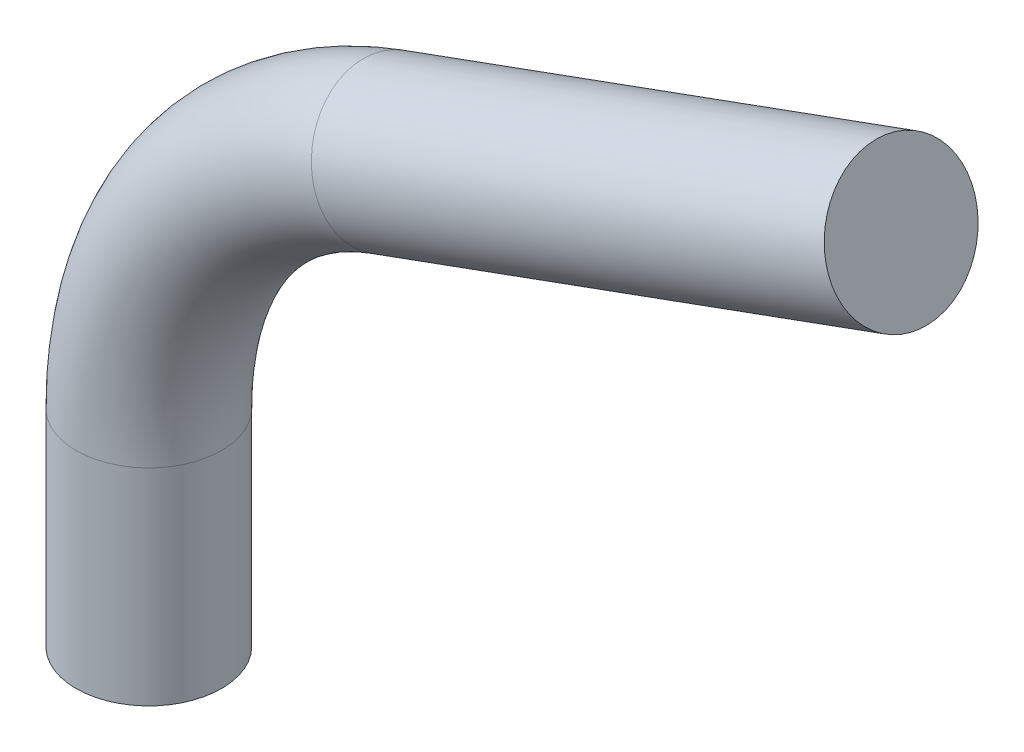
ISO-10303-21;
HEADER;
FILE_DESCRIPTION(('STEP AP214'),'2;1');
FILE_NAME('part.step','',(''),(''),'','','');
FILE_SCHEMA(('AUTOMOTIVE_DESIGN { 1 0 10303 214 1 1 1 1 }'));
ENDSEC;
DATA;
#1=APPLICATION_CONTEXT('core data for automotive mechanical design processes');
#2=APPLICATION_PROTOCOL_DEFINITION('international standard','automotive_design',2000,#1);
#3=PRODUCT_CONTEXT('',#1,'mechanical');
#4=PRODUCT('Part','Part','',(#3));
#5=PRODUCT_RELATED_PRODUCT_CATEGORY('part','',(#4));
#6=PRODUCT_DEFINITION_FORMATION('','',#4);
#7=PRODUCT_DEFINITION_CONTEXT('part definition',#1,'design');
#8=PRODUCT_DEFINITION('design','',#6,#7);
#9=PRODUCT_DEFINITION_SHAPE('','',#8);
#10=(LENGTH_UNIT() NAMED_UNIT(*) SI_UNIT(.MILLI.,.METRE.));
#11=(NAMED_UNIT(*) PLANE_ANGLE_UNIT() SI_UNIT($,.RADIAN.));
#12=(NAMED_UNIT(*) SI_UNIT($,.STERADIAN.) SOLID_ANGLE_UNIT());
#13=UNCERTAINTY_MEASURE_WITH_UNIT(LENGTH_MEASURE(1.E-05),#10,'distance_accuracy_value','');
#14=(GEOMETRIC_REPRESENTATION_CONTEXT(3) GLOBAL_UNCERTAINTY_ASSIGNED_CONTEXT((#13)) GLOBAL_UNIT_ASSIGNED_CONTEXT((#10,
#11,#12)) REPRESENTATION_CONTEXT('',''));
#15=CARTESIAN_POINT('',(0.,0.,0.));
#16=DIRECTION('',(0.,0.,1.));
#17=DIRECTION('',(1.,0.,0.));
#18=AXIS2_PLACEMENT_3D('',#15,#16,#17);
#19=CARTESIAN_POINT('',(0.,0.,0.));
#20=DIRECTION('',(0.,1.,0.));
#21=DIRECTION('',(0.,0.,1.));
#22=AXIS2_PLACEMENT_3D('',#19,#20,#21);
#23=PLANE('',#22);
#24=CARTESIAN_POINT('',(0.,0.,0.));
#25=DIRECTION('',(0.,1.,0.));
#26=DIRECTION('',(0.,0.,1.));
#27=AXIS2_PLACEMENT_3D('',#24,#25,#26);
#28=CIRCLE('',#27,3.);
#29=CARTESIAN_POINT('',(0.,0.,3.));
#30=VERTEX_POINT('',#29);
#31=EDGE_CURVE('E46',#30,#30,#28,.T.);
#32=ORIENTED_EDGE('',*,*,#31,.F.);
#33=EDGE_LOOP('',(#32));
#34=FACE_BOUND('',#33,.T.);
#35=ADVANCED_FACE('F34',(#34),#23,.F.);
#36=CARTESIAN_POINT('',(31.009856485935,30.286664729747,0.));
#37=DIRECTION('',(0.939692620785909,0.342020143325666,0.));
#38=DIRECTION('',(0.,0.,1.));
#39=AXIS2_PLACEMENT_3D('',#36,#37,#38);
#40=PLANE('',#39);
#41=CARTESIAN_POINT('',(31.009856485935,30.286664729747,0.));
#42=DIRECTION('',(0.939692620785909,0.342020143325666,0.));
#43=DIRECTION('',(0.,0.,1.));
#44=AXIS2_PLACEMENT_3D('',#41,#42,#43);
#45=CIRCLE('',#44,3.);
#46=CARTESIAN_POINT('',(31.009856485935,30.286664729747,3.));
#47=VERTEX_POINT('',#46);
#48=EDGE_CURVE('E11',#47,#47,#45,.T.);
#49=ORIENTED_EDGE('',*,*,#48,.T.);
#50=EDGE_LOOP('',(#49));
#51=FACE_BOUND('',#50,.T.);
#52=ADVANCED_FACE('F49',(#51),#40,.T.);
#53=CARTESIAN_POINT('',(0.,0.,0.));
#54=DIRECTION('',(0.,1.,0.));
#55=DIRECTION('',(0.,0.,1.));
#56=AXIS2_PLACEMENT_3D('',#53,#54,#55);
#57=CYLINDRICAL_SURFACE('',#56,3.);
#58=CARTESIAN_POINT('',(0.,8.49688692685432,0.));
#59=DIRECTION('',(0.,1.,0.));
#60=DIRECTION('',(0.,0.,1.));
#61=AXIS2_PLACEMENT_3D('',#58,#59,#60);
#62=CIRCLE('',#61,3.);
#63=CARTESIAN_POINT('',(-3.,8.49688692685432,0.));
#64=VERTEX_POINT('',#63);
#65=EDGE_CURVE('E59',#64,#64,#62,.T.);
#66=ORIENTED_EDGE('',*,*,#65,.F.);
#67=EDGE_LOOP('',(#66));
#68=FACE_BOUND('',#67,.T.);
#69=ORIENTED_EDGE('',*,*,#31,.T.);
#70=EDGE_LOOP('',(#69));
#71=FACE_BOUND('',#70,.T.);
#72=ADVANCED_FACE('F64',(#68,#71),#57,.T.);
#73=CARTESIAN_POINT('',(15.,8.49688692685432,0.));
#74=DIRECTION('',(0.,0.,-1.));
#75=DIRECTION('',(-1.,0.,0.));
#76=AXIS2_PLACEMENT_3D('',#73,#74,#75);
#77=TOROIDAL_SURFACE('',#76,15.,3.);
#78=CARTESIAN_POINT('',(9.86969785011501,22.592276238643,0.));
#79=DIRECTION('',(0.939692620785909,0.342020143325666,0.));
#80=DIRECTION('',(0.,0.,1.));
#81=AXIS2_PLACEMENT_3D('',#78,#79,#80);
#82=CIRCLE('',#81,3.);
#83=CARTESIAN_POINT('',(8.84363742013801,25.4113541010007,0.));
#84=VERTEX_POINT('',#83);
#85=EDGE_CURVE('E41',#84,#84,#82,.T.);
#86=CARTESIAN_POINT('',(15.,8.49688692685432,0.));
#87=DIRECTION('',(0.,0.,-1.));
#88=DIRECTION('',(-1.,0.,0.));
#89=AXIS2_PLACEMENT_3D('',#86,#87,#88);
#90=CIRCLE('',#89,18.);
#91=EDGE_CURVE('',#64,#84,#90,.T.);
#92=ORIENTED_EDGE('',*,*,#65,.T.);
#93=ORIENTED_EDGE('',*,*,#85,.F.);
#94=ORIENTED_EDGE('',*,*,#91,.T.);
#95=ORIENTED_EDGE('',*,*,#91,.F.);
#96=EDGE_LOOP('',(#92,#94,#93,#95));
#97=FACE_BOUND('',#96,.T.);
#98=ADVANCED_FACE('F54',(#97),#77,.T.);
#99=CARTESIAN_POINT('',(9.86969785011501,22.592276238643,0.));
#100=DIRECTION('',(0.939692620785909,0.342020143325666,0.));
#101=DIRECTION('',(-0.342020143325666,0.939692620785909,0.));
#102=AXIS2_PLACEMENT_3D('',#99,#100,#101);
#103=CYLINDRICAL_SURFACE('',#102,3.);
#104=ORIENTED_EDGE('',*,*,#48,.F.);
#105=EDGE_LOOP('',(#104));
#106=FACE_BOUND('',#105,.T.);
#107=ORIENTED_EDGE('',*,*,#85,.T.);
#108=EDGE_LOOP('',(#107));
#109=FACE_BOUND('',#108,.T.);
#110=ADVANCED_FACE('F51',(#106,#109),#103,.T.);
#111=CLOSED_SHELL('',(#35,#52,#72,#98,#110));
#112=MANIFOLD_SOLID_BREP('B2',#111);
#113=ADVANCED_BREP_SHAPE_REPRESENTATION('',(#18,#112),#14);
#114=SHAPE_DEFINITION_REPRESENTATION(#9,#113);
ENDSEC;
END-ISO-10303-21;
